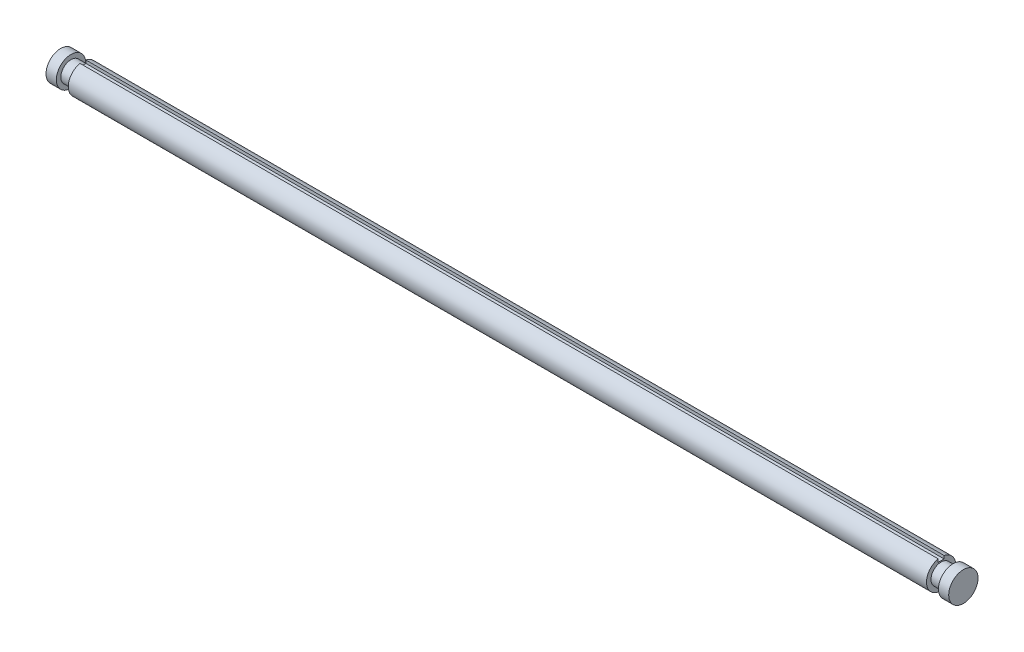
ISO-10303-21;
HEADER;
FILE_DESCRIPTION(('STEP AP214'),'2;1');
FILE_NAME('part.step','',(''),(''),'','','');
FILE_SCHEMA(('AUTOMOTIVE_DESIGN { 1 0 10303 214 1 1 1 1 }'));
ENDSEC;
DATA;
#1=APPLICATION_CONTEXT('core data for automotive mechanical design processes');
#2=APPLICATION_PROTOCOL_DEFINITION('international standard','automotive_design',2000,#1);
#3=PRODUCT_CONTEXT('',#1,'mechanical');
#4=PRODUCT('Part','Part','',(#3));
#5=PRODUCT_RELATED_PRODUCT_CATEGORY('part','',(#4));
#6=PRODUCT_DEFINITION_FORMATION('','',#4);
#7=PRODUCT_DEFINITION_CONTEXT('part definition',#1,'design');
#8=PRODUCT_DEFINITION('design','',#6,#7);
#9=PRODUCT_DEFINITION_SHAPE('','',#8);
#10=(LENGTH_UNIT() NAMED_UNIT(*) SI_UNIT(.MILLI.,.METRE.));
#11=(NAMED_UNIT(*) PLANE_ANGLE_UNIT() SI_UNIT($,.RADIAN.));
#12=(NAMED_UNIT(*) SI_UNIT($,.STERADIAN.) SOLID_ANGLE_UNIT());
#13=UNCERTAINTY_MEASURE_WITH_UNIT(LENGTH_MEASURE(1.E-05),#10,'distance_accuracy_value','');
#14=(GEOMETRIC_REPRESENTATION_CONTEXT(3) GLOBAL_UNCERTAINTY_ASSIGNED_CONTEXT((#13)) GLOBAL_UNIT_ASSIGNED_CONTEXT((#10,
#11,#12)) REPRESENTATION_CONTEXT('',''));
#15=CARTESIAN_POINT('',(0.,0.,0.));
#16=DIRECTION('',(0.,0.,1.));
#17=DIRECTION('',(1.,0.,0.));
#18=AXIS2_PLACEMENT_3D('',#15,#16,#17);
#19=CARTESIAN_POINT('',(48.1584,22.0218,0.));
#20=DIRECTION('',(1.,0.,0.));
#21=DIRECTION('',(0.,0.,-1.));
#22=AXIS2_PLACEMENT_3D('',#19,#20,#21);
#23=PLANE('',#22);
#24=CARTESIAN_POINT('',(48.1584,0.,0.));
#25=DIRECTION('',(-1.,0.,0.));
#26=DIRECTION('',(0.,0.,1.));
#27=AXIS2_PLACEMENT_3D('',#24,#25,#26);
#28=CIRCLE('',#27,22.0218);
#29=CARTESIAN_POINT('',(48.1584,0.,22.0218));
#30=VERTEX_POINT('',#29);
#31=EDGE_CURVE('E129',#30,#30,#28,.T.);
#32=ORIENTED_EDGE('',*,*,#31,.F.);
#33=EDGE_LOOP('',(#32));
#34=FACE_BOUND('',#33,.T.);
#35=DIRECTION('',(0.,1.,0.));
#36=VECTOR('',#35,1.);
#37=CARTESIAN_POINT('',(48.1584,24.60625,-6.35));
#38=LINE('',#37,#36);
#39=CARTESIAN_POINT('',(48.1584,24.60625,-6.35));
#40=VERTEX_POINT('',#39);
#41=CARTESIAN_POINT('',(48.1584,31.0890766653257,-6.35));
#42=VERTEX_POINT('',#41);
#43=EDGE_CURVE('E96',#40,#42,#38,.T.);
#44=ORIENTED_EDGE('',*,*,#43,.T.);
#45=CARTESIAN_POINT('',(48.1584,0.,0.));
#46=DIRECTION('',(-1.,0.,0.));
#47=DIRECTION('',(0.,0.,1.));
#48=AXIS2_PLACEMENT_3D('',#45,#46,#47);
#49=CIRCLE('',#48,31.73095);
#50=CARTESIAN_POINT('',(48.1584,31.0890766653257,6.35));
#51=VERTEX_POINT('',#50);
#52=EDGE_CURVE('E126',#42,#51,#49,.T.);
#53=ORIENTED_EDGE('',*,*,#52,.T.);
#54=DIRECTION('',(0.,-1.,0.));
#55=VECTOR('',#54,1.);
#56=CARTESIAN_POINT('',(48.1584,24.60625,6.35));
#57=LINE('',#56,#55);
#58=CARTESIAN_POINT('',(48.1584,24.60625,6.35));
#59=VERTEX_POINT('',#58);
#60=EDGE_CURVE('E92',#51,#59,#57,.T.);
#61=ORIENTED_EDGE('',*,*,#60,.T.);
#62=DIRECTION('',(0.,0.,-1.));
#63=VECTOR('',#62,1.);
#64=CARTESIAN_POINT('',(48.1584,24.60625,-6.35));
#65=LINE('',#64,#63);
#66=EDGE_CURVE('E105',#59,#40,#65,.T.);
#67=ORIENTED_EDGE('',*,*,#66,.T.);
#68=EDGE_LOOP('',(#44,#53,#61,#67));
#69=FACE_BOUND('',#68,.T.);
#70=ADVANCED_FACE('F43',(#34,#69),#23,.F.);
#71=CARTESIAN_POINT('',(-25.4,0.,0.));
#72=DIRECTION('',(-1.,0.,0.));
#73=DIRECTION('',(0.,0.,1.));
#74=AXIS2_PLACEMENT_3D('',#71,#72,#73);
#75=CYLINDRICAL_SURFACE('',#74,31.73095);
#76=DIRECTION('',(-1.,0.,0.));
#77=VECTOR('',#76,1.);
#78=CARTESIAN_POINT('',(-25.4,31.0890766653257,-6.35));
#79=LINE('',#78,#77);
#80=CARTESIAN_POINT('',(1904.7206,31.0890766653257,-6.35));
#81=VERTEX_POINT('',#80);
#82=EDGE_CURVE('E111',#81,#42,#79,.T.);
#83=ORIENTED_EDGE('',*,*,#82,.F.);
#84=CARTESIAN_POINT('',(1904.7206,0.,0.));
#85=DIRECTION('',(-1.,0.,0.));
#86=DIRECTION('',(0.,0.,1.));
#87=AXIS2_PLACEMENT_3D('',#84,#85,#86);
#88=CIRCLE('',#87,31.73095);
#89=CARTESIAN_POINT('',(1904.7206,31.0890766653257,6.35));
#90=VERTEX_POINT('',#89);
#91=EDGE_CURVE('E101',#81,#90,#88,.T.);
#92=ORIENTED_EDGE('',*,*,#91,.T.);
#93=DIRECTION('',(-1.,0.,0.));
#94=VECTOR('',#93,1.);
#95=CARTESIAN_POINT('',(-25.4,31.0890766653257,6.35));
#96=LINE('',#95,#94);
#97=EDGE_CURVE('E57',#51,#90,#96,.F.);
#98=ORIENTED_EDGE('',*,*,#97,.F.);
#99=ORIENTED_EDGE('',*,*,#52,.F.);
#100=EDGE_LOOP('',(#83,#92,#98,#99));
#101=FACE_BOUND('',#100,.T.);
#102=ADVANCED_FACE('F161',(#101),#75,.T.);
#103=CARTESIAN_POINT('',(1904.7206,31.73095,0.));
#104=DIRECTION('',(-1.,0.,0.));
#105=DIRECTION('',(0.,0.,1.));
#106=AXIS2_PLACEMENT_3D('',#103,#104,#105);
#107=PLANE('',#106);
#108=CARTESIAN_POINT('',(1904.7206,0.,0.));
#109=DIRECTION('',(-1.,0.,0.));
#110=DIRECTION('',(0.,0.,1.));
#111=AXIS2_PLACEMENT_3D('',#108,#109,#110);
#112=CIRCLE('',#111,22.0218);
#113=CARTESIAN_POINT('',(1904.7206,0.,22.0218));
#114=VERTEX_POINT('',#113);
#115=EDGE_CURVE('E122',#114,#114,#112,.T.);
#116=ORIENTED_EDGE('',*,*,#115,.T.);
#117=EDGE_LOOP('',(#116));
#118=FACE_BOUND('',#117,.T.);
#119=DIRECTION('',(0.,1.,0.));
#120=VECTOR('',#119,1.);
#121=CARTESIAN_POINT('',(1904.7206,24.60625,-6.35));
#122=LINE('',#121,#120);
#123=CARTESIAN_POINT('',(1904.7206,24.60625,-6.35));
#124=VERTEX_POINT('',#123);
#125=EDGE_CURVE('E65',#124,#81,#122,.T.);
#126=ORIENTED_EDGE('',*,*,#125,.F.);
#127=DIRECTION('',(0.,0.,-1.));
#128=VECTOR('',#127,1.);
#129=CARTESIAN_POINT('',(1904.7206,24.60625,-6.35));
#130=LINE('',#129,#128);
#131=CARTESIAN_POINT('',(1904.7206,24.60625,6.35));
#132=VERTEX_POINT('',#131);
#133=EDGE_CURVE('E85',#132,#124,#130,.T.);
#134=ORIENTED_EDGE('',*,*,#133,.F.);
#135=DIRECTION('',(0.,-1.,0.));
#136=VECTOR('',#135,1.);
#137=CARTESIAN_POINT('',(1904.7206,31.73095,6.35));
#138=LINE('',#137,#136);
#139=EDGE_CURVE('E11',#90,#132,#138,.T.);
#140=ORIENTED_EDGE('',*,*,#139,.F.);
#141=ORIENTED_EDGE('',*,*,#91,.F.);
#142=EDGE_LOOP('',(#126,#134,#140,#141));
#143=FACE_BOUND('',#142,.T.);
#144=ADVANCED_FACE('F99',(#118,#143),#107,.F.);
#145=CARTESIAN_POINT('',(0.,0.,0.));
#146=DIRECTION('',(1.,0.,0.));
#147=DIRECTION('',(0.,0.,-1.));
#148=AXIS2_PLACEMENT_3D('',#145,#146,#147);
#149=PLANE('',#148);
#150=CARTESIAN_POINT('',(0.,0.,0.));
#151=DIRECTION('',(-1.,0.,0.));
#152=DIRECTION('',(0.,0.,1.));
#153=AXIS2_PLACEMENT_3D('',#150,#151,#152);
#154=CIRCLE('',#153,31.73095);
#155=CARTESIAN_POINT('',(0.,0.,31.73095));
#156=VERTEX_POINT('',#155);
#157=EDGE_CURVE('E51',#156,#156,#154,.T.);
#158=ORIENTED_EDGE('',*,*,#157,.T.);
#159=EDGE_LOOP('',(#158));
#160=FACE_BOUND('',#159,.T.);
#161=ADVANCED_FACE('F45',(#160),#149,.F.);
#162=CARTESIAN_POINT('',(-25.4,0.,0.));
#163=DIRECTION('',(-1.,0.,0.));
#164=DIRECTION('',(0.,0.,1.));
#165=AXIS2_PLACEMENT_3D('',#162,#163,#164);
#166=CYLINDRICAL_SURFACE('',#165,31.73095);
#167=ORIENTED_EDGE('',*,*,#157,.F.);
#168=EDGE_LOOP('',(#167));
#169=FACE_BOUND('',#168,.T.);
#170=CARTESIAN_POINT('',(22.352,0.,0.));
#171=DIRECTION('',(-1.,0.,0.));
#172=DIRECTION('',(0.,0.,1.));
#173=AXIS2_PLACEMENT_3D('',#170,#171,#172);
#174=CIRCLE('',#173,31.73095);
#175=CARTESIAN_POINT('',(22.352,0.,31.73095));
#176=VERTEX_POINT('',#175);
#177=EDGE_CURVE('E135',#176,#176,#174,.T.);
#178=ORIENTED_EDGE('',*,*,#177,.T.);
#179=EDGE_LOOP('',(#178));
#180=FACE_BOUND('',#179,.T.);
#181=ADVANCED_FACE('F141',(#169,#180),#166,.T.);
#182=CARTESIAN_POINT('',(22.352,31.73095,0.));
#183=DIRECTION('',(-1.,0.,0.));
#184=DIRECTION('',(0.,0.,1.));
#185=AXIS2_PLACEMENT_3D('',#182,#183,#184);
#186=PLANE('',#185);
#187=ORIENTED_EDGE('',*,*,#177,.F.);
#188=EDGE_LOOP('',(#187));
#189=FACE_BOUND('',#188,.T.);
#190=CARTESIAN_POINT('',(22.352,0.,0.));
#191=DIRECTION('',(-1.,0.,0.));
#192=DIRECTION('',(0.,0.,1.));
#193=AXIS2_PLACEMENT_3D('',#190,#191,#192);
#194=CIRCLE('',#193,22.0218);
#195=CARTESIAN_POINT('',(22.352,0.,22.0218));
#196=VERTEX_POINT('',#195);
#197=EDGE_CURVE('E132',#196,#196,#194,.T.);
#198=ORIENTED_EDGE('',*,*,#197,.T.);
#199=EDGE_LOOP('',(#198));
#200=FACE_BOUND('',#199,.T.);
#201=ADVANCED_FACE('F144',(#189,#200),#186,.F.);
#202=CARTESIAN_POINT('',(-25.4,0.,0.));
#203=DIRECTION('',(-1.,0.,0.));
#204=DIRECTION('',(0.,0.,1.));
#205=AXIS2_PLACEMENT_3D('',#202,#203,#204);
#206=CYLINDRICAL_SURFACE('',#205,22.0218);
#207=ORIENTED_EDGE('',*,*,#197,.F.);
#208=EDGE_LOOP('',(#207));
#209=FACE_BOUND('',#208,.T.);
#210=ORIENTED_EDGE('',*,*,#31,.T.);
#211=EDGE_LOOP('',(#210));
#212=FACE_BOUND('',#211,.T.);
#213=ADVANCED_FACE('F149',(#209,#212),#206,.T.);
#214=CARTESIAN_POINT('',(-25.4,0.,0.));
#215=DIRECTION('',(-1.,0.,0.));
#216=DIRECTION('',(0.,0.,1.));
#217=AXIS2_PLACEMENT_3D('',#214,#215,#216);
#218=CYLINDRICAL_SURFACE('',#217,22.0218);
#219=ORIENTED_EDGE('',*,*,#115,.F.);
#220=EDGE_LOOP('',(#219));
#221=FACE_BOUND('',#220,.T.);
#222=CARTESIAN_POINT('',(1930.527,0.,0.));
#223=DIRECTION('',(-1.,0.,0.));
#224=DIRECTION('',(0.,0.,1.));
#225=AXIS2_PLACEMENT_3D('',#222,#223,#224);
#226=CIRCLE('',#225,22.0218);
#227=CARTESIAN_POINT('',(1930.527,0.,22.0218));
#228=VERTEX_POINT('',#227);
#229=EDGE_CURVE('E119',#228,#228,#226,.T.);
#230=ORIENTED_EDGE('',*,*,#229,.T.);
#231=EDGE_LOOP('',(#230));
#232=FACE_BOUND('',#231,.T.);
#233=ADVANCED_FACE('F155',(#221,#232),#218,.T.);
#234=CARTESIAN_POINT('',(1930.527,22.0218,0.));
#235=DIRECTION('',(1.,0.,0.));
#236=DIRECTION('',(0.,0.,-1.));
#237=AXIS2_PLACEMENT_3D('',#234,#235,#236);
#238=PLANE('',#237);
#239=ORIENTED_EDGE('',*,*,#229,.F.);
#240=EDGE_LOOP('',(#239));
#241=FACE_BOUND('',#240,.T.);
#242=CARTESIAN_POINT('',(1930.527,0.,0.));
#243=DIRECTION('',(-1.,0.,0.));
#244=DIRECTION('',(0.,0.,1.));
#245=AXIS2_PLACEMENT_3D('',#242,#243,#244);
#246=CIRCLE('',#245,31.73095);
#247=CARTESIAN_POINT('',(1930.527,0.,31.73095));
#248=VERTEX_POINT('',#247);
#249=EDGE_CURVE('E116',#248,#248,#246,.T.);
#250=ORIENTED_EDGE('',*,*,#249,.T.);
#251=EDGE_LOOP('',(#250));
#252=FACE_BOUND('',#251,.T.);
#253=ADVANCED_FACE('F175',(#241,#252),#238,.F.);
#254=CARTESIAN_POINT('',(-25.4,0.,0.));
#255=DIRECTION('',(-1.,0.,0.));
#256=DIRECTION('',(0.,0.,1.));
#257=AXIS2_PLACEMENT_3D('',#254,#255,#256);
#258=CYLINDRICAL_SURFACE('',#257,31.73095);
#259=ORIENTED_EDGE('',*,*,#249,.F.);
#260=EDGE_LOOP('',(#259));
#261=FACE_BOUND('',#260,.T.);
#262=CARTESIAN_POINT('',(1952.752,0.,0.));
#263=DIRECTION('',(-1.,0.,0.));
#264=DIRECTION('',(0.,0.,1.));
#265=AXIS2_PLACEMENT_3D('',#262,#263,#264);
#266=CIRCLE('',#265,31.73095);
#267=CARTESIAN_POINT('',(1952.752,0.,31.73095));
#268=VERTEX_POINT('',#267);
#269=EDGE_CURVE('E113',#268,#268,#266,.T.);
#270=ORIENTED_EDGE('',*,*,#269,.T.);
#271=EDGE_LOOP('',(#270));
#272=FACE_BOUND('',#271,.T.);
#273=ADVANCED_FACE('F179',(#261,#272),#258,.T.);
#274=CARTESIAN_POINT('',(1952.752,31.73095,0.));
#275=DIRECTION('',(-1.,0.,0.));
#276=DIRECTION('',(0.,0.,1.));
#277=AXIS2_PLACEMENT_3D('',#274,#275,#276);
#278=PLANE('',#277);
#279=ORIENTED_EDGE('',*,*,#269,.F.);
#280=EDGE_LOOP('',(#279));
#281=FACE_BOUND('',#280,.T.);
#282=ADVANCED_FACE('F183',(#281),#278,.F.);
#283=CARTESIAN_POINT('',(1904.7206,24.60625,-6.35));
#284=DIRECTION('',(0.,0.,1.));
#285=DIRECTION('',(1.,0.,0.));
#286=AXIS2_PLACEMENT_3D('',#283,#284,#285);
#287=PLANE('',#286);
#288=ORIENTED_EDGE('',*,*,#82,.T.);
#289=ORIENTED_EDGE('',*,*,#43,.F.);
#290=DIRECTION('',(-1.,0.,0.));
#291=VECTOR('',#290,1.);
#292=CARTESIAN_POINT('',(1904.7206,24.60625,-6.35));
#293=LINE('',#292,#291);
#294=EDGE_CURVE('E88',#124,#40,#293,.T.);
#295=ORIENTED_EDGE('',*,*,#294,.F.);
#296=ORIENTED_EDGE('',*,*,#125,.T.);
#297=EDGE_LOOP('',(#288,#289,#295,#296));
#298=FACE_BOUND('',#297,.T.);
#299=ADVANCED_FACE('F94',(#298),#287,.T.);
#300=CARTESIAN_POINT('',(1904.7206,24.60625,6.35));
#301=DIRECTION('',(0.,0.,-1.));
#302=DIRECTION('',(-1.,0.,0.));
#303=AXIS2_PLACEMENT_3D('',#300,#301,#302);
#304=PLANE('',#303);
#305=ORIENTED_EDGE('',*,*,#97,.T.);
#306=ORIENTED_EDGE('',*,*,#139,.T.);
#307=DIRECTION('',(-1.,0.,0.));
#308=VECTOR('',#307,1.);
#309=CARTESIAN_POINT('',(1904.7206,24.60625,6.35));
#310=LINE('',#309,#308);
#311=EDGE_CURVE('E90',#132,#59,#310,.T.);
#312=ORIENTED_EDGE('',*,*,#311,.T.);
#313=ORIENTED_EDGE('',*,*,#60,.F.);
#314=EDGE_LOOP('',(#305,#306,#312,#313));
#315=FACE_BOUND('',#314,.T.);
#316=ADVANCED_FACE('F190',(#315),#304,.T.);
#317=CARTESIAN_POINT('',(1904.7206,24.60625,-6.35));
#318=DIRECTION('',(0.,1.,0.));
#319=DIRECTION('',(0.,0.,1.));
#320=AXIS2_PLACEMENT_3D('',#317,#318,#319);
#321=PLANE('',#320);
#322=ORIENTED_EDGE('',*,*,#66,.F.);
#323=ORIENTED_EDGE('',*,*,#311,.F.);
#324=ORIENTED_EDGE('',*,*,#133,.T.);
#325=ORIENTED_EDGE('',*,*,#294,.T.);
#326=EDGE_LOOP('',(#322,#323,#324,#325));
#327=FACE_BOUND('',#326,.T.);
#328=ADVANCED_FACE('F87',(#327),#321,.T.);
#329=CLOSED_SHELL('',(#70,#102,#144,#161,#181,#201,#213,#233,#253,#273,#282,#299,#316,#328));
#330=MANIFOLD_SOLID_BREP('B2',#329);
#331=ADVANCED_BREP_SHAPE_REPRESENTATION('',(#18,#330),#14);
#332=SHAPE_DEFINITION_REPRESENTATION(#9,#331);
ENDSEC;
END-ISO-10303-21;
